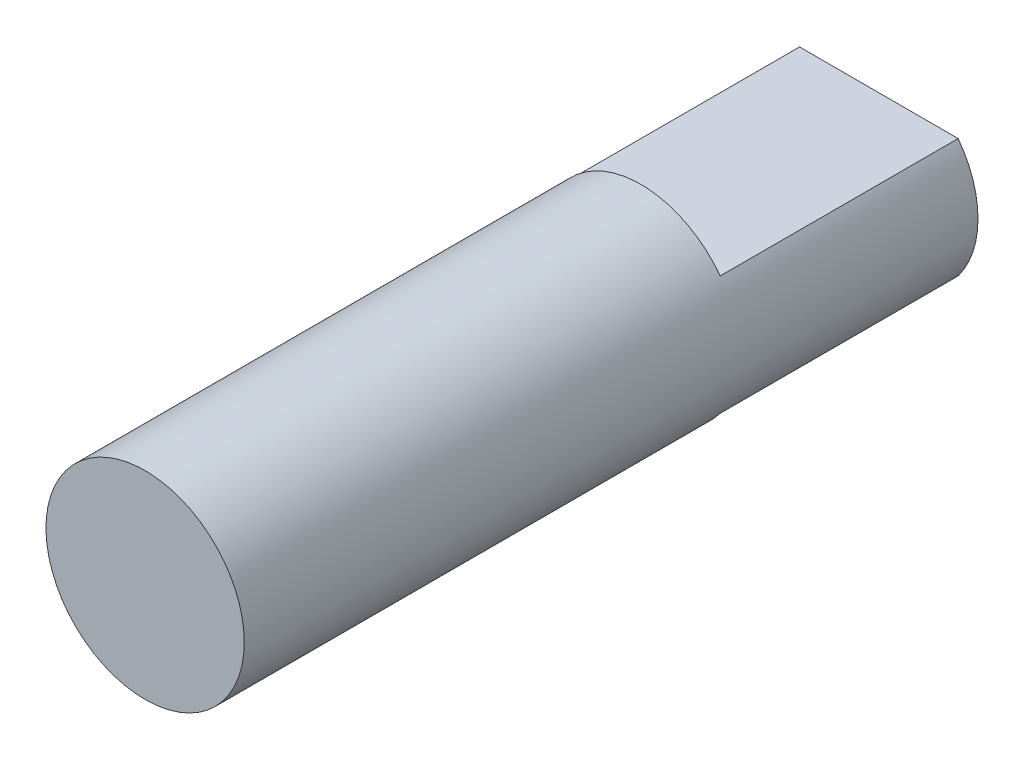
ISO-10303-21;
HEADER;
FILE_DESCRIPTION(('STEP AP214'),'2;1');
FILE_NAME('part.step','',(''),(''),'','','');
FILE_SCHEMA(('AUTOMOTIVE_DESIGN { 1 0 10303 214 1 1 1 1 }'));
ENDSEC;
DATA;
#1=APPLICATION_CONTEXT('core data for automotive mechanical design processes');
#2=APPLICATION_PROTOCOL_DEFINITION('international standard','automotive_design',2000,#1);
#3=PRODUCT_CONTEXT('',#1,'mechanical');
#4=PRODUCT('Part','Part','',(#3));
#5=PRODUCT_RELATED_PRODUCT_CATEGORY('part','',(#4));
#6=PRODUCT_DEFINITION_FORMATION('','',#4);
#7=PRODUCT_DEFINITION_CONTEXT('part definition',#1,'design');
#8=PRODUCT_DEFINITION('design','',#6,#7);
#9=PRODUCT_DEFINITION_SHAPE('','',#8);
#10=(LENGTH_UNIT() NAMED_UNIT(*) SI_UNIT(.MILLI.,.METRE.));
#11=(NAMED_UNIT(*) PLANE_ANGLE_UNIT() SI_UNIT($,.RADIAN.));
#12=(NAMED_UNIT(*) SI_UNIT($,.STERADIAN.) SOLID_ANGLE_UNIT());
#13=UNCERTAINTY_MEASURE_WITH_UNIT(LENGTH_MEASURE(1.E-05),#10,'distance_accuracy_value','');
#14=(GEOMETRIC_REPRESENTATION_CONTEXT(3) GLOBAL_UNCERTAINTY_ASSIGNED_CONTEXT((#13)) GLOBAL_UNIT_ASSIGNED_CONTEXT((#10,
#11,#12)) REPRESENTATION_CONTEXT('',''));
#15=CARTESIAN_POINT('',(0.,0.,0.));
#16=DIRECTION('',(0.,0.,1.));
#17=DIRECTION('',(1.,0.,0.));
#18=AXIS2_PLACEMENT_3D('',#15,#16,#17);
#19=CARTESIAN_POINT('',(0.,0.,18.5));
#20=DIRECTION('',(0.,0.,-1.));
#21=DIRECTION('',(-1.,0.,0.));
#22=AXIS2_PLACEMENT_3D('',#19,#20,#21);
#23=CYLINDRICAL_SURFACE('',#22,2.5);
#24=CARTESIAN_POINT('',(0.,0.,18.5));
#25=DIRECTION('',(0.,0.,1.));
#26=DIRECTION('',(1.,0.,0.));
#27=AXIS2_PLACEMENT_3D('',#24,#25,#26);
#28=CIRCLE('',#27,2.5);
#29=CARTESIAN_POINT('',(2.5,0.,18.5));
#30=VERTEX_POINT('',#29);
#31=EDGE_CURVE('E11',#30,#30,#28,.T.);
#32=ORIENTED_EDGE('',*,*,#31,.F.);
#33=EDGE_LOOP('',(#32));
#34=FACE_BOUND('',#33,.T.);
#35=DIRECTION('',(0.,0.,-1.));
#36=VECTOR('',#35,1.);
#37=CARTESIAN_POINT('',(2.,1.5,6.));
#38=LINE('',#37,#36);
#39=CARTESIAN_POINT('',(2.,1.5,6.));
#40=VERTEX_POINT('',#39);
#41=CARTESIAN_POINT('',(2.,1.5,0.));
#42=VERTEX_POINT('',#41);
#43=EDGE_CURVE('E58',#40,#42,#38,.T.);
#44=ORIENTED_EDGE('',*,*,#43,.F.);
#45=CARTESIAN_POINT('',(0.,0.,6.));
#46=DIRECTION('',(0.,0.,1.));
#47=DIRECTION('',(1.,0.,0.));
#48=AXIS2_PLACEMENT_3D('',#45,#46,#47);
#49=CIRCLE('',#48,2.5);
#50=CARTESIAN_POINT('',(-2.,1.5,6.));
#51=VERTEX_POINT('',#50);
#52=EDGE_CURVE('E78',#40,#51,#49,.T.);
#53=ORIENTED_EDGE('',*,*,#52,.T.);
#54=DIRECTION('',(0.,0.,-1.));
#55=VECTOR('',#54,1.);
#56=CARTESIAN_POINT('',(-2.,1.5,6.));
#57=LINE('',#56,#55);
#58=CARTESIAN_POINT('',(-2.,1.5,0.));
#59=VERTEX_POINT('',#58);
#60=EDGE_CURVE('E83',#51,#59,#57,.T.);
#61=ORIENTED_EDGE('',*,*,#60,.T.);
#62=CARTESIAN_POINT('',(0.,0.,0.));
#63=DIRECTION('',(0.,0.,1.));
#64=DIRECTION('',(1.,0.,0.));
#65=AXIS2_PLACEMENT_3D('',#62,#63,#64);
#66=CIRCLE('',#65,2.5);
#67=CARTESIAN_POINT('',(-2.,-1.5,0.));
#68=VERTEX_POINT('',#67);
#69=EDGE_CURVE('E43',#59,#68,#66,.T.);
#70=ORIENTED_EDGE('',*,*,#69,.T.);
#71=DIRECTION('',(0.,0.,-1.));
#72=VECTOR('',#71,1.);
#73=CARTESIAN_POINT('',(-2.,-1.5,6.));
#74=LINE('',#73,#72);
#75=CARTESIAN_POINT('',(-2.,-1.5,6.));
#76=VERTEX_POINT('',#75);
#77=EDGE_CURVE('E50',#76,#68,#74,.T.);
#78=ORIENTED_EDGE('',*,*,#77,.F.);
#79=CARTESIAN_POINT('',(0.,0.,6.));
#80=DIRECTION('',(0.,0.,1.));
#81=DIRECTION('',(1.,0.,0.));
#82=AXIS2_PLACEMENT_3D('',#79,#80,#81);
#83=CIRCLE('',#82,2.5);
#84=CARTESIAN_POINT('',(2.,-1.5,6.));
#85=VERTEX_POINT('',#84);
#86=EDGE_CURVE('E97',#76,#85,#83,.T.);
#87=ORIENTED_EDGE('',*,*,#86,.T.);
#88=DIRECTION('',(0.,0.,-1.));
#89=VECTOR('',#88,1.);
#90=CARTESIAN_POINT('',(2.,-1.5,6.));
#91=LINE('',#90,#89);
#92=CARTESIAN_POINT('',(2.,-1.5,0.));
#93=VERTEX_POINT('',#92);
#94=EDGE_CURVE('E95',#85,#93,#91,.T.);
#95=ORIENTED_EDGE('',*,*,#94,.T.);
#96=EDGE_CURVE('E38',#93,#42,#66,.T.);
#97=ORIENTED_EDGE('',*,*,#96,.T.);
#98=EDGE_LOOP('',(#44,#53,#61,#70,#78,#87,#95,#97));
#99=FACE_BOUND('',#98,.T.);
#100=ADVANCED_FACE('F35',(#34,#99),#23,.T.);
#101=CARTESIAN_POINT('',(0.,0.,0.));
#102=DIRECTION('',(0.,0.,1.));
#103=DIRECTION('',(1.,0.,0.));
#104=AXIS2_PLACEMENT_3D('',#101,#102,#103);
#105=PLANE('',#104);
#106=DIRECTION('',(1.,0.,0.));
#107=VECTOR('',#106,1.);
#108=CARTESIAN_POINT('',(-2.,1.5,0.));
#109=LINE('',#108,#107);
#110=EDGE_CURVE('E86',#59,#42,#109,.T.);
#111=ORIENTED_EDGE('',*,*,#110,.T.);
#112=ORIENTED_EDGE('',*,*,#96,.F.);
#113=DIRECTION('',(1.,0.,0.));
#114=VECTOR('',#113,1.);
#115=CARTESIAN_POINT('',(-2.,-1.5,0.));
#116=LINE('',#115,#114);
#117=EDGE_CURVE('E99',#68,#93,#116,.T.);
#118=ORIENTED_EDGE('',*,*,#117,.F.);
#119=ORIENTED_EDGE('',*,*,#69,.F.);
#120=EDGE_LOOP('',(#111,#112,#118,#119));
#121=FACE_BOUND('',#120,.T.);
#122=ADVANCED_FACE('F110',(#121),#105,.F.);
#123=CARTESIAN_POINT('',(0.,0.,18.5));
#124=DIRECTION('',(0.,0.,1.));
#125=DIRECTION('',(1.,0.,0.));
#126=AXIS2_PLACEMENT_3D('',#123,#124,#125);
#127=PLANE('',#126);
#128=ORIENTED_EDGE('',*,*,#31,.T.);
#129=EDGE_LOOP('',(#128));
#130=FACE_BOUND('',#129,.T.);
#131=ADVANCED_FACE('F113',(#130),#127,.T.);
#132=CARTESIAN_POINT('',(-2.,-1.5,6.));
#133=DIRECTION('',(0.,1.,0.));
#134=DIRECTION('',(0.,0.,1.));
#135=AXIS2_PLACEMENT_3D('',#132,#133,#134);
#136=PLANE('',#135);
#137=ORIENTED_EDGE('',*,*,#117,.T.);
#138=ORIENTED_EDGE('',*,*,#94,.F.);
#139=DIRECTION('',(1.,0.,0.));
#140=VECTOR('',#139,1.);
#141=CARTESIAN_POINT('',(-2.,-1.5,6.));
#142=LINE('',#141,#140);
#143=EDGE_CURVE('E101',#76,#85,#142,.T.);
#144=ORIENTED_EDGE('',*,*,#143,.F.);
#145=ORIENTED_EDGE('',*,*,#77,.T.);
#146=EDGE_LOOP('',(#137,#138,#144,#145));
#147=FACE_BOUND('',#146,.T.);
#148=ADVANCED_FACE('F111',(#147),#136,.F.);
#149=CARTESIAN_POINT('',(0.,0.,6.));
#150=DIRECTION('',(0.,0.,1.));
#151=DIRECTION('',(1.,0.,0.));
#152=AXIS2_PLACEMENT_3D('',#149,#150,#151);
#153=PLANE('',#152);
#154=ORIENTED_EDGE('',*,*,#143,.T.);
#155=ORIENTED_EDGE('',*,*,#86,.F.);
#156=EDGE_LOOP('',(#154,#155));
#157=FACE_BOUND('',#156,.T.);
#158=ADVANCED_FACE('F106',(#157),#153,.F.);
#159=CARTESIAN_POINT('',(-2.,1.5,6.));
#160=DIRECTION('',(0.,1.,0.));
#161=DIRECTION('',(0.,0.,1.));
#162=AXIS2_PLACEMENT_3D('',#159,#160,#161);
#163=PLANE('',#162);
#164=ORIENTED_EDGE('',*,*,#110,.F.);
#165=ORIENTED_EDGE('',*,*,#60,.F.);
#166=DIRECTION('',(1.,0.,0.));
#167=VECTOR('',#166,1.);
#168=CARTESIAN_POINT('',(-2.,1.5,6.));
#169=LINE('',#168,#167);
#170=EDGE_CURVE('E80',#51,#40,#169,.T.);
#171=ORIENTED_EDGE('',*,*,#170,.T.);
#172=ORIENTED_EDGE('',*,*,#43,.T.);
#173=EDGE_LOOP('',(#164,#165,#171,#172));
#174=FACE_BOUND('',#173,.T.);
#175=ADVANCED_FACE('F85',(#174),#163,.T.);
#176=CARTESIAN_POINT('',(0.,0.,6.));
#177=DIRECTION('',(0.,0.,1.));
#178=DIRECTION('',(1.,0.,0.));
#179=AXIS2_PLACEMENT_3D('',#176,#177,#178);
#180=PLANE('',#179);
#181=ORIENTED_EDGE('',*,*,#170,.F.);
#182=ORIENTED_EDGE('',*,*,#52,.F.);
#183=EDGE_LOOP('',(#181,#182));
#184=FACE_BOUND('',#183,.T.);
#185=ADVANCED_FACE('F79',(#184),#180,.F.);
#186=CLOSED_SHELL('',(#100,#122,#131,#148,#158,#175,#185));
#187=MANIFOLD_SOLID_BREP('B2',#186);
#188=ADVANCED_BREP_SHAPE_REPRESENTATION('',(#18,#187),#14);
#189=SHAPE_DEFINITION_REPRESENTATION(#9,#188);
ENDSEC;
END-ISO-10303-21;
